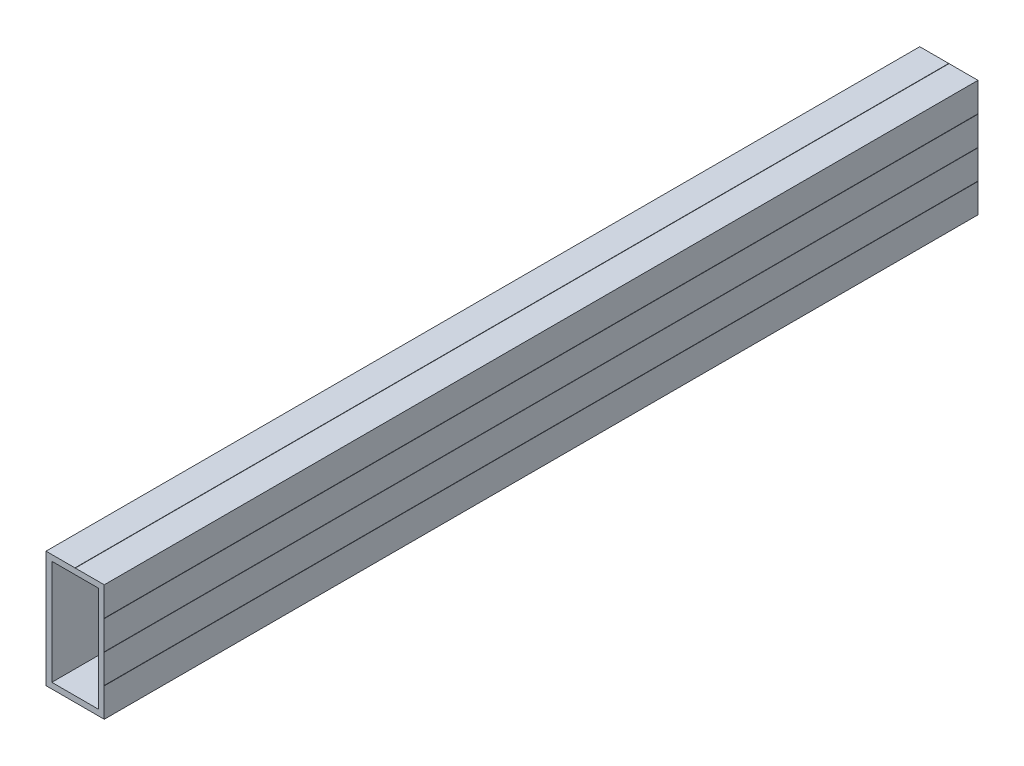
ISO-10303-21;
HEADER;
FILE_DESCRIPTION(('STEP AP214'),'2;1');
FILE_NAME('part.step','',(''),(''),'','','');
FILE_SCHEMA(('AUTOMOTIVE_DESIGN { 1 0 10303 214 1 1 1 1 }'));
ENDSEC;
DATA;
#1=APPLICATION_CONTEXT('core data for automotive mechanical design processes');
#2=APPLICATION_PROTOCOL_DEFINITION('international standard','automotive_design',2000,#1);
#3=PRODUCT_CONTEXT('',#1,'mechanical');
#4=PRODUCT('Part','Part','',(#3));
#5=PRODUCT_RELATED_PRODUCT_CATEGORY('part','',(#4));
#6=PRODUCT_DEFINITION_FORMATION('','',#4);
#7=PRODUCT_DEFINITION_CONTEXT('part definition',#1,'design');
#8=PRODUCT_DEFINITION('design','',#6,#7);
#9=PRODUCT_DEFINITION_SHAPE('','',#8);
#10=(LENGTH_UNIT() NAMED_UNIT(*) SI_UNIT(.MILLI.,.METRE.));
#11=(NAMED_UNIT(*) PLANE_ANGLE_UNIT() SI_UNIT($,.RADIAN.));
#12=(NAMED_UNIT(*) SI_UNIT($,.STERADIAN.) SOLID_ANGLE_UNIT());
#13=UNCERTAINTY_MEASURE_WITH_UNIT(LENGTH_MEASURE(1.E-05),#10,'distance_accuracy_value','');
#14=(GEOMETRIC_REPRESENTATION_CONTEXT(3) GLOBAL_UNCERTAINTY_ASSIGNED_CONTEXT((#13)) GLOBAL_UNIT_ASSIGNED_CONTEXT((#10,
#11,#12)) REPRESENTATION_CONTEXT('',''));
#15=CARTESIAN_POINT('',(0.,0.,0.));
#16=DIRECTION('',(0.,0.,1.));
#17=DIRECTION('',(1.,0.,0.));
#18=AXIS2_PLACEMENT_3D('',#15,#16,#17);
#19=CARTESIAN_POINT('',(-12.7,0.,0.));
#20=DIRECTION('',(1.,0.,0.));
#21=DIRECTION('',(0.,0.,-1.));
#22=AXIS2_PLACEMENT_3D('',#19,#20,#21);
#23=PLANE('',#22);
#24=DIRECTION('',(0.,0.,1.));
#25=VECTOR('',#24,1.);
#26=CARTESIAN_POINT('',(-12.7,25.4,-749.3));
#27=LINE('',#26,#25);
#28=CARTESIAN_POINT('',(-12.7,25.4,368.3));
#29=VERTEX_POINT('',#28);
#30=CARTESIAN_POINT('',(-12.7,25.4,749.3));
#31=VERTEX_POINT('',#30);
#32=EDGE_CURVE('E336',#29,#31,#27,.T.);
#33=ORIENTED_EDGE('',*,*,#32,.F.);
#34=DIRECTION('',(0.,-1.,0.));
#35=VECTOR('',#34,1.);
#36=CARTESIAN_POINT('',(-12.7,0.,368.3));
#37=LINE('',#36,#35);
#38=CARTESIAN_POINT('',(-12.7000000000132,12.7762,368.3));
#39=VERTEX_POINT('',#38);
#40=EDGE_CURVE('E409',#29,#39,#37,.T.);
#41=ORIENTED_EDGE('',*,*,#40,.T.);
#42=DIRECTION('',(0.,0.,1.));
#43=VECTOR('',#42,1.);
#44=CARTESIAN_POINT('',(-12.7000000000132,12.7762,-749.3));
#45=LINE('',#44,#43);
#46=CARTESIAN_POINT('',(-12.7000000000132,12.7762,749.3));
#47=VERTEX_POINT('',#46);
#48=EDGE_CURVE('E272',#39,#47,#45,.T.);
#49=ORIENTED_EDGE('',*,*,#48,.T.);
#50=DIRECTION('',(0.,-1.,0.));
#51=VECTOR('',#50,1.);
#52=CARTESIAN_POINT('',(-12.7,25.4,749.3));
#53=LINE('',#52,#51);
#54=EDGE_CURVE('E340',#31,#47,#53,.T.);
#55=ORIENTED_EDGE('',*,*,#54,.F.);
#56=EDGE_LOOP('',(#33,#41,#49,#55));
#57=FACE_BOUND('',#56,.T.);
#58=ADVANCED_FACE('F35',(#57),#23,.F.);
#59=DIRECTION('',(0.,0.,-1.));
#60=VECTOR('',#59,1.);
#61=CARTESIAN_POINT('',(-12.7,12.6238000000132,0.));
#62=LINE('',#61,#60);
#63=CARTESIAN_POINT('',(-12.7,12.6238000000132,368.3));
#64=VERTEX_POINT('',#63);
#65=CARTESIAN_POINT('',(-12.7,12.6238000000132,749.3));
#66=VERTEX_POINT('',#65);
#67=EDGE_CURVE('E274',#64,#66,#62,.F.);
#68=ORIENTED_EDGE('',*,*,#67,.F.);
#69=DIRECTION('',(0.,-1.,0.));
#70=VECTOR('',#69,1.);
#71=CARTESIAN_POINT('',(-12.7,0.,368.3));
#72=LINE('',#71,#70);
#73=CARTESIAN_POINT('',(-12.7,0.0761999999999976,368.3));
#74=VERTEX_POINT('',#73);
#75=EDGE_CURVE('E50',#64,#74,#72,.T.);
#76=ORIENTED_EDGE('',*,*,#75,.T.);
#77=DIRECTION('',(0.,0.,1.));
#78=VECTOR('',#77,1.);
#79=CARTESIAN_POINT('',(-12.7,0.0761999999999976,-749.3));
#80=LINE('',#79,#78);
#81=CARTESIAN_POINT('',(-12.7,0.0761999999999976,749.3));
#82=VERTEX_POINT('',#81);
#83=EDGE_CURVE('E280',#74,#82,#80,.T.);
#84=ORIENTED_EDGE('',*,*,#83,.T.);
#85=EDGE_CURVE('E344',#66,#82,#53,.T.);
#86=ORIENTED_EDGE('',*,*,#85,.F.);
#87=EDGE_LOOP('',(#68,#76,#84,#86));
#88=FACE_BOUND('',#87,.T.);
#89=ADVANCED_FACE('F514',(#88),#23,.F.);
#90=DIRECTION('',(0.,0.,-1.));
#91=VECTOR('',#90,1.);
#92=CARTESIAN_POINT('',(-12.7,-0.0761999999999985,0.));
#93=LINE('',#92,#91);
#94=CARTESIAN_POINT('',(-12.7,-0.0761999999999982,368.3));
#95=VERTEX_POINT('',#94);
#96=CARTESIAN_POINT('',(-12.7,-0.0761999999999985,749.3));
#97=VERTEX_POINT('',#96);
#98=EDGE_CURVE('E282',#95,#97,#93,.F.);
#99=ORIENTED_EDGE('',*,*,#98,.F.);
#100=DIRECTION('',(0.,-1.,0.));
#101=VECTOR('',#100,1.);
#102=CARTESIAN_POINT('',(-12.7,0.,368.3));
#103=LINE('',#102,#101);
#104=CARTESIAN_POINT('',(-12.7,-12.6238,368.3));
#105=VERTEX_POINT('',#104);
#106=EDGE_CURVE('E431',#95,#105,#103,.T.);
#107=ORIENTED_EDGE('',*,*,#106,.T.);
#108=DIRECTION('',(0.,0.,1.));
#109=VECTOR('',#108,1.);
#110=CARTESIAN_POINT('',(-12.7,-12.6238,-749.3));
#111=LINE('',#110,#109);
#112=CARTESIAN_POINT('',(-12.7,-12.6238,749.3));
#113=VERTEX_POINT('',#112);
#114=EDGE_CURVE('E291',#105,#113,#111,.T.);
#115=ORIENTED_EDGE('',*,*,#114,.T.);
#116=EDGE_CURVE('E597',#97,#113,#53,.T.);
#117=ORIENTED_EDGE('',*,*,#116,.F.);
#118=EDGE_LOOP('',(#99,#107,#115,#117));
#119=FACE_BOUND('',#118,.T.);
#120=ADVANCED_FACE('F506',(#119),#23,.F.);
#121=CARTESIAN_POINT('',(-12.7,-25.4,749.3));
#122=DIRECTION('',(0.,-1.,0.));
#123=DIRECTION('',(0.,0.,-1.));
#124=AXIS2_PLACEMENT_3D('',#121,#122,#123);
#125=PLANE('',#124);
#126=DIRECTION('',(-1.,0.,0.));
#127=VECTOR('',#126,1.);
#128=CARTESIAN_POINT('',(-12.7,-25.4,368.3));
#129=LINE('',#128,#127);
#130=CARTESIAN_POINT('',(-0.0762000000000089,-25.4,368.3));
#131=VERTEX_POINT('',#130);
#132=CARTESIAN_POINT('',(-12.7,-25.4,368.3));
#133=VERTEX_POINT('',#132);
#134=EDGE_CURVE('E453',#131,#133,#129,.T.);
#135=ORIENTED_EDGE('',*,*,#134,.F.);
#136=DIRECTION('',(0.,0.,1.));
#137=VECTOR('',#136,1.);
#138=CARTESIAN_POINT('',(-0.0762000000000087,-25.4,-749.3));
#139=LINE('',#138,#137);
#140=CARTESIAN_POINT('',(-0.0762000000000087,-25.4,749.3));
#141=VERTEX_POINT('',#140);
#142=EDGE_CURVE('E297',#131,#141,#139,.T.);
#143=ORIENTED_EDGE('',*,*,#142,.T.);
#144=DIRECTION('',(1.,0.,0.));
#145=VECTOR('',#144,1.);
#146=CARTESIAN_POINT('',(-12.7,-25.4,749.3));
#147=LINE('',#146,#145);
#148=CARTESIAN_POINT('',(-12.7,-25.4,749.3));
#149=VERTEX_POINT('',#148);
#150=EDGE_CURVE('E43',#149,#141,#147,.T.);
#151=ORIENTED_EDGE('',*,*,#150,.F.);
#152=DIRECTION('',(0.,0.,-1.));
#153=VECTOR('',#152,1.);
#154=CARTESIAN_POINT('',(-12.7,-25.4,749.3));
#155=LINE('',#154,#153);
#156=EDGE_CURVE('E343',#149,#133,#155,.T.);
#157=ORIENTED_EDGE('',*,*,#156,.T.);
#158=EDGE_LOOP('',(#135,#143,#151,#157));
#159=FACE_BOUND('',#158,.T.);
#160=ADVANCED_FACE('F511',(#159),#125,.T.);
#161=CARTESIAN_POINT('',(12.7,0.,0.));
#162=DIRECTION('',(1.,0.,0.));
#163=DIRECTION('',(0.,0.,-1.));
#164=AXIS2_PLACEMENT_3D('',#161,#162,#163);
#165=PLANE('',#164);
#166=DIRECTION('',(0.,-1.,0.));
#167=VECTOR('',#166,1.);
#168=CARTESIAN_POINT('',(12.7,0.,368.3));
#169=LINE('',#168,#167);
#170=CARTESIAN_POINT('',(12.7,-12.7762,368.3));
#171=VERTEX_POINT('',#170);
#172=CARTESIAN_POINT('',(12.7,-25.4,368.3));
#173=VERTEX_POINT('',#172);
#174=EDGE_CURVE('E477',#171,#173,#169,.T.);
#175=ORIENTED_EDGE('',*,*,#174,.F.);
#176=DIRECTION('',(0.,0.,1.));
#177=VECTOR('',#176,1.);
#178=CARTESIAN_POINT('',(12.7,-12.7762,-749.3));
#179=LINE('',#178,#177);
#180=CARTESIAN_POINT('',(12.7,-12.7762,749.3));
#181=VERTEX_POINT('',#180);
#182=EDGE_CURVE('E306',#171,#181,#179,.T.);
#183=ORIENTED_EDGE('',*,*,#182,.T.);
#184=DIRECTION('',(0.,-1.,0.));
#185=VECTOR('',#184,1.);
#186=CARTESIAN_POINT('',(12.7,25.4,749.3));
#187=LINE('',#186,#185);
#188=CARTESIAN_POINT('',(12.7,-25.4,749.3));
#189=VERTEX_POINT('',#188);
#190=EDGE_CURVE('E350',#181,#189,#187,.T.);
#191=ORIENTED_EDGE('',*,*,#190,.T.);
#192=DIRECTION('',(0.,0.,-1.));
#193=VECTOR('',#192,1.);
#194=CARTESIAN_POINT('',(12.7,-25.4,749.3));
#195=LINE('',#194,#193);
#196=EDGE_CURVE('E339',#189,#173,#195,.T.);
#197=ORIENTED_EDGE('',*,*,#196,.T.);
#198=EDGE_LOOP('',(#175,#183,#191,#197));
#199=FACE_BOUND('',#198,.T.);
#200=ADVANCED_FACE('F526',(#199),#165,.T.);
#201=DIRECTION('',(0.,-1.,0.));
#202=VECTOR('',#201,1.);
#203=CARTESIAN_POINT('',(12.7,0.,368.3));
#204=LINE('',#203,#202);
#205=CARTESIAN_POINT('',(12.7,-0.0762000000000003,368.3));
#206=VERTEX_POINT('',#205);
#207=CARTESIAN_POINT('',(12.7,-12.6238,368.3));
#208=VERTEX_POINT('',#207);
#209=EDGE_CURVE('E464',#206,#208,#204,.T.);
#210=ORIENTED_EDGE('',*,*,#209,.F.);
#211=DIRECTION('',(0.,0.,1.));
#212=VECTOR('',#211,1.);
#213=CARTESIAN_POINT('',(12.7,-0.0762000000000003,-749.3));
#214=LINE('',#213,#212);
#215=CARTESIAN_POINT('',(12.7,-0.0762000000000003,749.3));
#216=VERTEX_POINT('',#215);
#217=EDGE_CURVE('E314',#206,#216,#214,.T.);
#218=ORIENTED_EDGE('',*,*,#217,.T.);
#219=CARTESIAN_POINT('',(12.7,-12.6238,749.3));
#220=VERTEX_POINT('',#219);
#221=EDGE_CURVE('E558',#216,#220,#187,.T.);
#222=ORIENTED_EDGE('',*,*,#221,.T.);
#223=DIRECTION('',(0.,0.,-1.));
#224=VECTOR('',#223,1.);
#225=CARTESIAN_POINT('',(12.7,-12.6238,0.));
#226=LINE('',#225,#224);
#227=EDGE_CURVE('E308',#208,#220,#226,.F.);
#228=ORIENTED_EDGE('',*,*,#227,.F.);
#229=EDGE_LOOP('',(#210,#218,#222,#228));
#230=FACE_BOUND('',#229,.T.);
#231=ADVANCED_FACE('F535',(#230),#165,.T.);
#232=DIRECTION('',(0.,-1.,0.));
#233=VECTOR('',#232,1.);
#234=CARTESIAN_POINT('',(12.7,0.,368.3));
#235=LINE('',#234,#233);
#236=CARTESIAN_POINT('',(12.6999999999868,12.6238,368.3));
#237=VERTEX_POINT('',#236);
#238=CARTESIAN_POINT('',(12.7,0.0761999999999985,368.3));
#239=VERTEX_POINT('',#238);
#240=EDGE_CURVE('E451',#237,#239,#235,.T.);
#241=ORIENTED_EDGE('',*,*,#240,.F.);
#242=DIRECTION('',(0.,0.,1.));
#243=VECTOR('',#242,1.);
#244=CARTESIAN_POINT('',(12.6999999999868,12.6238,-749.3));
#245=LINE('',#244,#243);
#246=CARTESIAN_POINT('',(12.6999999999868,12.6238,749.3));
#247=VERTEX_POINT('',#246);
#248=EDGE_CURVE('E325',#237,#247,#245,.T.);
#249=ORIENTED_EDGE('',*,*,#248,.T.);
#250=CARTESIAN_POINT('',(12.7,0.0761999999999985,749.3));
#251=VERTEX_POINT('',#250);
#252=EDGE_CURVE('E354',#247,#251,#187,.T.);
#253=ORIENTED_EDGE('',*,*,#252,.T.);
#254=DIRECTION('',(0.,0.,-1.));
#255=VECTOR('',#254,1.);
#256=CARTESIAN_POINT('',(12.7,0.0761999999999985,0.));
#257=LINE('',#256,#255);
#258=EDGE_CURVE('E316',#239,#251,#257,.F.);
#259=ORIENTED_EDGE('',*,*,#258,.F.);
#260=EDGE_LOOP('',(#241,#249,#253,#259));
#261=FACE_BOUND('',#260,.T.);
#262=ADVANCED_FACE('F527',(#261),#165,.T.);
#263=CARTESIAN_POINT('',(-12.7,25.4,-749.3));
#264=DIRECTION('',(0.,1.,0.));
#265=DIRECTION('',(0.,0.,1.));
#266=AXIS2_PLACEMENT_3D('',#263,#264,#265);
#267=PLANE('',#266);
#268=DIRECTION('',(1.,0.,0.));
#269=VECTOR('',#268,1.);
#270=CARTESIAN_POINT('',(-12.7,25.4,368.3));
#271=LINE('',#270,#269);
#272=CARTESIAN_POINT('',(0.0761999999999968,25.4,368.3));
#273=VERTEX_POINT('',#272);
#274=CARTESIAN_POINT('',(12.7,25.4,368.3));
#275=VERTEX_POINT('',#274);
#276=EDGE_CURVE('E429',#273,#275,#271,.T.);
#277=ORIENTED_EDGE('',*,*,#276,.F.);
#278=DIRECTION('',(0.,0.,1.));
#279=VECTOR('',#278,1.);
#280=CARTESIAN_POINT('',(0.0761999999999968,25.4,-749.3));
#281=LINE('',#280,#279);
#282=CARTESIAN_POINT('',(0.0761999999999968,25.4,749.3));
#283=VERTEX_POINT('',#282);
#284=EDGE_CURVE('E330',#273,#283,#281,.T.);
#285=ORIENTED_EDGE('',*,*,#284,.T.);
#286=DIRECTION('',(1.,0.,0.));
#287=VECTOR('',#286,1.);
#288=CARTESIAN_POINT('',(-12.7,25.4,749.3));
#289=LINE('',#288,#287);
#290=CARTESIAN_POINT('',(12.7,25.4,749.3));
#291=VERTEX_POINT('',#290);
#292=EDGE_CURVE('E347',#283,#291,#289,.T.);
#293=ORIENTED_EDGE('',*,*,#292,.T.);
#294=DIRECTION('',(0.,0.,1.));
#295=VECTOR('',#294,1.);
#296=CARTESIAN_POINT('',(12.7,25.4,-749.3));
#297=LINE('',#296,#295);
#298=EDGE_CURVE('E348',#275,#291,#297,.T.);
#299=ORIENTED_EDGE('',*,*,#298,.F.);
#300=EDGE_LOOP('',(#277,#285,#293,#299));
#301=FACE_BOUND('',#300,.T.);
#302=ADVANCED_FACE('F538',(#301),#267,.T.);
#303=DIRECTION('',(1.,0.,0.));
#304=VECTOR('',#303,1.);
#305=CARTESIAN_POINT('',(-12.7,25.4,368.3));
#306=LINE('',#305,#304);
#307=CARTESIAN_POINT('',(-0.0761999999999985,25.4,368.3));
#308=VERTEX_POINT('',#307);
#309=EDGE_CURVE('E414',#29,#308,#306,.T.);
#310=ORIENTED_EDGE('',*,*,#309,.F.);
#311=ORIENTED_EDGE('',*,*,#32,.T.);
#312=CARTESIAN_POINT('',(-0.0761999999999985,25.4,749.3));
#313=VERTEX_POINT('',#312);
#314=EDGE_CURVE('E360',#31,#313,#289,.T.);
#315=ORIENTED_EDGE('',*,*,#314,.T.);
#316=DIRECTION('',(0.,0.,1.));
#317=VECTOR('',#316,1.);
#318=CARTESIAN_POINT('',(-0.0761999999999985,25.4,-749.3));
#319=LINE('',#318,#317);
#320=EDGE_CURVE('E332',#308,#313,#319,.T.);
#321=ORIENTED_EDGE('',*,*,#320,.F.);
#322=EDGE_LOOP('',(#310,#311,#315,#321));
#323=FACE_BOUND('',#322,.T.);
#324=ADVANCED_FACE('F508',(#323),#267,.T.);
#325=DIRECTION('',(-1.,0.,0.));
#326=VECTOR('',#325,1.);
#327=CARTESIAN_POINT('',(-12.7,-25.4,368.3));
#328=LINE('',#327,#326);
#329=CARTESIAN_POINT('',(0.0761999999999916,-25.4,368.3));
#330=VERTEX_POINT('',#329);
#331=EDGE_CURVE('E475',#173,#330,#328,.T.);
#332=ORIENTED_EDGE('',*,*,#331,.F.);
#333=ORIENTED_EDGE('',*,*,#196,.F.);
#334=CARTESIAN_POINT('',(0.0761999999999898,-25.4,749.3));
#335=VERTEX_POINT('',#334);
#336=EDGE_CURVE('E359',#335,#189,#147,.T.);
#337=ORIENTED_EDGE('',*,*,#336,.F.);
#338=DIRECTION('',(0.,0.,1.));
#339=VECTOR('',#338,1.);
#340=CARTESIAN_POINT('',(0.0761999999999916,-25.4,-749.3));
#341=LINE('',#340,#339);
#342=EDGE_CURVE('E301',#330,#335,#341,.T.);
#343=ORIENTED_EDGE('',*,*,#342,.F.);
#344=EDGE_LOOP('',(#332,#333,#337,#343));
#345=FACE_BOUND('',#344,.T.);
#346=ADVANCED_FACE('F496',(#345),#125,.T.);
#347=CARTESIAN_POINT('',(-12.7,25.4,749.3));
#348=DIRECTION('',(0.,0.,1.));
#349=DIRECTION('',(1.,0.,0.));
#350=AXIS2_PLACEMENT_3D('',#347,#348,#349);
#351=PLANE('',#350);
#352=DIRECTION('',(1.,0.,0.));
#353=VECTOR('',#352,1.);
#354=CARTESIAN_POINT('',(-10.16,-22.86,749.3));
#355=LINE('',#354,#353);
#356=CARTESIAN_POINT('',(-10.16,-22.86,749.3));
#357=VERTEX_POINT('',#356);
#358=CARTESIAN_POINT('',(10.16,-22.86,749.3));
#359=VERTEX_POINT('',#358);
#360=EDGE_CURVE('E479',#357,#359,#355,.T.);
#361=ORIENTED_EDGE('',*,*,#360,.F.);
#362=DIRECTION('',(0.,-1.,0.));
#363=VECTOR('',#362,1.);
#364=CARTESIAN_POINT('',(-10.16,22.86,749.3));
#365=LINE('',#364,#363);
#366=CARTESIAN_POINT('',(-10.16,22.86,749.3));
#367=VERTEX_POINT('',#366);
#368=EDGE_CURVE('E264',#367,#357,#365,.T.);
#369=ORIENTED_EDGE('',*,*,#368,.F.);
#370=DIRECTION('',(-1.,0.,0.));
#371=VECTOR('',#370,1.);
#372=CARTESIAN_POINT('',(10.16,22.86,749.3));
#373=LINE('',#372,#371);
#374=CARTESIAN_POINT('',(10.16,22.86,749.3));
#375=VERTEX_POINT('',#374);
#376=EDGE_CURVE('E483',#375,#367,#373,.T.);
#377=ORIENTED_EDGE('',*,*,#376,.F.);
#378=DIRECTION('',(0.,1.,0.));
#379=VECTOR('',#378,1.);
#380=CARTESIAN_POINT('',(10.16,-22.86,749.3));
#381=LINE('',#380,#379);
#382=EDGE_CURVE('E258',#359,#375,#381,.T.);
#383=ORIENTED_EDGE('',*,*,#382,.F.);
#384=EDGE_LOOP('',(#361,#369,#377,#383));
#385=FACE_BOUND('',#384,.T.);
#386=DIRECTION('',(-0.707106781186539,0.707106781186555,0.));
#387=VECTOR('',#386,1.);
#388=CARTESIAN_POINT('',(-12.5476000000263,12.6238000000132,749.3));
#389=LINE('',#388,#387);
#390=CARTESIAN_POINT('',(-12.6238000000066,12.6999999999934,749.3));
#391=VERTEX_POINT('',#390);
#392=EDGE_CURVE('E268',#391,#47,#389,.T.);
#393=ORIENTED_EDGE('',*,*,#392,.F.);
#394=DIRECTION('',(-0.707106781247692,-0.707106781125403,0.));
#395=VECTOR('',#394,1.);
#396=CARTESIAN_POINT('',(-6.3119000000066,19.0118999989018,749.3));
#397=LINE('',#396,#395);
#398=EDGE_CURVE('E271',#66,#391,#397,.F.);
#399=ORIENTED_EDGE('',*,*,#398,.F.);
#400=ORIENTED_EDGE('',*,*,#85,.T.);
#401=DIRECTION('',(-1.,0.,0.));
#402=VECTOR('',#401,1.);
#403=CARTESIAN_POINT('',(-12.5476,0.0761999999999985,749.3));
#404=LINE('',#403,#402);
#405=CARTESIAN_POINT('',(-12.5475999999737,0.0761999999999985,749.3));
#406=VERTEX_POINT('',#405);
#407=EDGE_CURVE('E275',#406,#82,#404,.T.);
#408=ORIENTED_EDGE('',*,*,#407,.F.);
#409=DIRECTION('',(-0.707106781247692,-0.707106781125403,0.));
#410=VECTOR('',#409,1.);
#411=CARTESIAN_POINT('',(0.0380999999999923,12.661899997797,749.3));
#412=LINE('',#411,#410);
#413=EDGE_CURVE('E278',#97,#406,#412,.F.);
#414=ORIENTED_EDGE('',*,*,#413,.F.);
#415=ORIENTED_EDGE('',*,*,#116,.T.);
#416=DIRECTION('',(-0.707106781186551,0.707106781186543,0.));
#417=VECTOR('',#416,1.);
#418=CARTESIAN_POINT('',(-12.5476,-12.7762,749.3));
#419=LINE('',#418,#417);
#420=CARTESIAN_POINT('',(-12.6238,-12.7,749.3));
#421=VERTEX_POINT('',#420);
#422=EDGE_CURVE('E283',#421,#113,#419,.T.);
#423=ORIENTED_EDGE('',*,*,#422,.F.);
#424=DIRECTION('',(-0.707106781186537,-0.707106781186558,0.));
#425=VECTOR('',#424,1.);
#426=CARTESIAN_POINT('',(6.38809999999999,6.31190000000056,749.3));
#427=LINE('',#426,#425);
#428=CARTESIAN_POINT('',(-12.7,-12.7762,749.3));
#429=VERTEX_POINT('',#428);
#430=EDGE_CURVE('E286',#429,#421,#427,.F.);
#431=ORIENTED_EDGE('',*,*,#430,.F.);
#432=EDGE_CURVE('E338',#429,#149,#53,.T.);
#433=ORIENTED_EDGE('',*,*,#432,.T.);
#434=ORIENTED_EDGE('',*,*,#150,.T.);
#435=DIRECTION('',(0.707106781186552,0.707106781186544,0.));
#436=VECTOR('',#435,1.);
#437=CARTESIAN_POINT('',(19.0118999999999,-6.31190000000029,749.3));
#438=LINE('',#437,#436);
#439=CARTESIAN_POINT('',(0.,-25.3238,749.3));
#440=VERTEX_POINT('',#439);
#441=EDGE_CURVE('E296',#440,#141,#438,.F.);
#442=ORIENTED_EDGE('',*,*,#441,.F.);
#443=DIRECTION('',(-0.707106781186547,0.707106781186548,0.));
#444=VECTOR('',#443,1.);
#445=CARTESIAN_POINT('',(0.0761999999999916,-25.4,749.3));
#446=LINE('',#445,#444);
#447=EDGE_CURVE('E293',#335,#440,#446,.T.);
#448=ORIENTED_EDGE('',*,*,#447,.F.);
#449=ORIENTED_EDGE('',*,*,#336,.T.);
#450=ORIENTED_EDGE('',*,*,#190,.F.);
#451=DIRECTION('',(0.707106781186539,-0.707106781186556,0.));
#452=VECTOR('',#451,1.);
#453=CARTESIAN_POINT('',(12.5476,-12.6238,749.3));
#454=LINE('',#453,#452);
#455=CARTESIAN_POINT('',(12.6238,-12.7,749.3));
#456=VERTEX_POINT('',#455);
#457=EDGE_CURVE('E299',#456,#181,#454,.T.);
#458=ORIENTED_EDGE('',*,*,#457,.F.);
#459=DIRECTION('',(0.707106781186553,0.707106781186542,0.));
#460=VECTOR('',#459,1.);
#461=CARTESIAN_POINT('',(19.0118999999998,-6.3119000000003,749.3));
#462=LINE('',#461,#460);
#463=EDGE_CURVE('E305',#220,#456,#462,.F.);
#464=ORIENTED_EDGE('',*,*,#463,.F.);
#465=ORIENTED_EDGE('',*,*,#221,.F.);
#466=DIRECTION('',(1.,0.,0.));
#467=VECTOR('',#466,1.);
#468=CARTESIAN_POINT('',(12.5476,-0.0761999999999985,749.3));
#469=LINE('',#468,#467);
#470=CARTESIAN_POINT('',(12.5476,-0.0761999999999985,749.3));
#471=VERTEX_POINT('',#470);
#472=EDGE_CURVE('E309',#471,#216,#469,.T.);
#473=ORIENTED_EDGE('',*,*,#472,.F.);
#474=DIRECTION('',(0.707106781186553,0.707106781186542,0.));
#475=VECTOR('',#474,1.);
#476=CARTESIAN_POINT('',(12.6618999999998,0.038099999999798,749.3));
#477=LINE('',#476,#475);
#478=EDGE_CURVE('E312',#251,#471,#477,.F.);
#479=ORIENTED_EDGE('',*,*,#478,.F.);
#480=ORIENTED_EDGE('',*,*,#252,.F.);
#481=DIRECTION('',(0.707106781186544,-0.707106781186552,0.));
#482=VECTOR('',#481,1.);
#483=CARTESIAN_POINT('',(12.5475999999736,12.7762000000132,749.3));
#484=LINE('',#483,#482);
#485=CARTESIAN_POINT('',(12.6237999999868,12.7,749.3));
#486=VERTEX_POINT('',#485);
#487=EDGE_CURVE('E317',#486,#247,#484,.T.);
#488=ORIENTED_EDGE('',*,*,#487,.F.);
#489=DIRECTION('',(0.707106781125415,0.707106781247681,0.));
#490=VECTOR('',#489,1.);
#491=CARTESIAN_POINT('',(6.31190000218278,6.38810000110456,749.3));
#492=LINE('',#491,#490);
#493=CARTESIAN_POINT('',(12.6999999999868,12.7762000000132,749.3));
#494=VERTEX_POINT('',#493);
#495=EDGE_CURVE('E320',#494,#486,#492,.F.);
#496=ORIENTED_EDGE('',*,*,#495,.F.);
#497=EDGE_CURVE('E351',#291,#494,#187,.T.);
#498=ORIENTED_EDGE('',*,*,#497,.F.);
#499=ORIENTED_EDGE('',*,*,#292,.F.);
#500=DIRECTION('',(-0.707106781186552,-0.707106781186543,0.));
#501=VECTOR('',#500,1.);
#502=CARTESIAN_POINT('',(-6.31190000000008,19.0119,749.3));
#503=LINE('',#502,#501);
#504=CARTESIAN_POINT('',(0.,25.3238,749.3));
#505=VERTEX_POINT('',#504);
#506=EDGE_CURVE('E331',#505,#283,#503,.F.);
#507=ORIENTED_EDGE('',*,*,#506,.F.);
#508=DIRECTION('',(0.707106781186548,-0.707106781186547,0.));
#509=VECTOR('',#508,1.);
#510=CARTESIAN_POINT('',(-0.0761999999999985,25.4,749.3));
#511=LINE('',#510,#509);
#512=EDGE_CURVE('E327',#313,#505,#511,.T.);
#513=ORIENTED_EDGE('',*,*,#512,.F.);
#514=ORIENTED_EDGE('',*,*,#314,.F.);
#515=ORIENTED_EDGE('',*,*,#54,.T.);
#516=EDGE_LOOP('',(#393,#399,#400,#408,#414,#415,#423,#431,#433,#434,#442,#448,#449,#450,#458,
#464,#465,#473,#479,#480,#488,#496,#498,#499,#507,#513,#514,#515));
#517=FACE_BOUND('',#516,.T.);
#518=ADVANCED_FACE('F402',(#385,#517),#351,.T.);
#519=DIRECTION('',(0.,0.,1.));
#520=VECTOR('',#519,1.);
#521=CARTESIAN_POINT('',(-12.7,-12.7762,-749.3));
#522=LINE('',#521,#520);
#523=CARTESIAN_POINT('',(-12.7,-12.7762,368.3));
#524=VERTEX_POINT('',#523);
#525=EDGE_CURVE('E288',#524,#429,#522,.T.);
#526=ORIENTED_EDGE('',*,*,#525,.F.);
#527=DIRECTION('',(0.,-1.,0.));
#528=VECTOR('',#527,1.);
#529=CARTESIAN_POINT('',(-12.7,0.,368.3));
#530=LINE('',#529,#528);
#531=EDGE_CURVE('E448',#524,#133,#530,.T.);
#532=ORIENTED_EDGE('',*,*,#531,.T.);
#533=ORIENTED_EDGE('',*,*,#156,.F.);
#534=ORIENTED_EDGE('',*,*,#432,.F.);
#535=EDGE_LOOP('',(#526,#532,#533,#534));
#536=FACE_BOUND('',#535,.T.);
#537=ADVANCED_FACE('F495',(#536),#23,.F.);
#538=DIRECTION('',(0.,-1.,0.));
#539=VECTOR('',#538,1.);
#540=CARTESIAN_POINT('',(12.7,0.,368.3));
#541=LINE('',#540,#539);
#542=CARTESIAN_POINT('',(12.7,12.7762000000132,368.3));
#543=VERTEX_POINT('',#542);
#544=EDGE_CURVE('E437',#275,#543,#541,.T.);
#545=ORIENTED_EDGE('',*,*,#544,.F.);
#546=ORIENTED_EDGE('',*,*,#298,.T.);
#547=ORIENTED_EDGE('',*,*,#497,.T.);
#548=DIRECTION('',(0.,0.,1.));
#549=VECTOR('',#548,1.);
#550=CARTESIAN_POINT('',(12.6999999999868,12.7762000000132,-749.3));
#551=LINE('',#550,#549);
#552=EDGE_CURVE('E322',#543,#494,#551,.T.);
#553=ORIENTED_EDGE('',*,*,#552,.F.);
#554=EDGE_LOOP('',(#545,#546,#547,#553));
#555=FACE_BOUND('',#554,.T.);
#556=ADVANCED_FACE('F503',(#555),#165,.T.);
#557=CARTESIAN_POINT('',(0.0761999999999968,25.4,-749.3));
#558=DIRECTION('',(-0.707106781186543,0.707106781186552,0.));
#559=DIRECTION('',(-0.707106781186552,-0.707106781186543,0.));
#560=AXIS2_PLACEMENT_3D('',#557,#558,#559);
#561=PLANE('',#560);
#562=ORIENTED_EDGE('',*,*,#284,.F.);
#563=DIRECTION('',(0.707106781186552,0.707106781186543,0.));
#564=VECTOR('',#563,1.);
#565=CARTESIAN_POINT('',(0.0761999999999968,25.4,368.3));
#566=LINE('',#565,#564);
#567=CARTESIAN_POINT('',(0.,25.3238,368.3));
#568=VERTEX_POINT('',#567);
#569=EDGE_CURVE('E426',#273,#568,#566,.F.);
#570=ORIENTED_EDGE('',*,*,#569,.T.);
#571=DIRECTION('',(0.,0.,-1.));
#572=VECTOR('',#571,1.);
#573=CARTESIAN_POINT('',(0.,25.3238,-749.3));
#574=LINE('',#573,#572);
#575=EDGE_CURVE('E334',#568,#505,#574,.F.);
#576=ORIENTED_EDGE('',*,*,#575,.T.);
#577=ORIENTED_EDGE('',*,*,#506,.T.);
#578=EDGE_LOOP('',(#562,#570,#576,#577));
#579=FACE_BOUND('',#578,.T.);
#580=ADVANCED_FACE('F524',(#579),#561,.T.);
#581=CARTESIAN_POINT('',(-0.0761999999999985,25.4,-749.3));
#582=DIRECTION('',(-0.707106781186547,-0.707106781186547,0.));
#583=DIRECTION('',(0.707106781186548,-0.707106781186548,0.));
#584=AXIS2_PLACEMENT_3D('',#581,#582,#583);
#585=PLANE('',#584);
#586=ORIENTED_EDGE('',*,*,#575,.F.);
#587=DIRECTION('',(-0.707106781186548,0.707106781186548,0.));
#588=VECTOR('',#587,1.);
#589=CARTESIAN_POINT('',(-0.0761999999999985,25.4,368.3));
#590=LINE('',#589,#588);
#591=EDGE_CURVE('E423',#568,#308,#590,.T.);
#592=ORIENTED_EDGE('',*,*,#591,.T.);
#593=ORIENTED_EDGE('',*,*,#320,.T.);
#594=ORIENTED_EDGE('',*,*,#512,.T.);
#595=EDGE_LOOP('',(#586,#592,#593,#594));
#596=FACE_BOUND('',#595,.T.);
#597=ADVANCED_FACE('F521',(#596),#585,.F.);
#598=CARTESIAN_POINT('',(12.5475999999736,12.7762000000132,-749.3));
#599=DIRECTION('',(-0.707106781186551,-0.707106781186544,0.));
#600=DIRECTION('',(0.707106781186544,-0.707106781186551,0.));
#601=AXIS2_PLACEMENT_3D('',#598,#599,#600);
#602=PLANE('',#601);
#603=ORIENTED_EDGE('',*,*,#248,.F.);
#604=DIRECTION('',(-0.707106781186544,0.707106781186551,0.));
#605=VECTOR('',#604,1.);
#606=CARTESIAN_POINT('',(12.5475999999736,12.7762000000132,368.3));
#607=LINE('',#606,#605);
#608=CARTESIAN_POINT('',(12.6237999999868,12.7,368.3));
#609=VERTEX_POINT('',#608);
#610=EDGE_CURVE('E445',#237,#609,#607,.T.);
#611=ORIENTED_EDGE('',*,*,#610,.T.);
#612=DIRECTION('',(0.,0.,-1.));
#613=VECTOR('',#612,1.);
#614=CARTESIAN_POINT('',(12.6237999999868,12.7,-749.3));
#615=LINE('',#614,#613);
#616=EDGE_CURVE('E324',#609,#486,#615,.F.);
#617=ORIENTED_EDGE('',*,*,#616,.T.);
#618=ORIENTED_EDGE('',*,*,#487,.T.);
#619=EDGE_LOOP('',(#603,#611,#617,#618));
#620=FACE_BOUND('',#619,.T.);
#621=ADVANCED_FACE('F551',(#620),#602,.F.);
#622=CARTESIAN_POINT('',(12.6999999999868,12.7762000000132,-749.3));
#623=DIRECTION('',(0.70710678124768,-0.707106781125414,0.));
#624=DIRECTION('',(0.707106781125415,0.707106781247681,0.));
#625=AXIS2_PLACEMENT_3D('',#622,#623,#624);
#626=PLANE('',#625);
#627=ORIENTED_EDGE('',*,*,#616,.F.);
#628=DIRECTION('',(-0.707106781125415,-0.707106781247681,0.));
#629=VECTOR('',#628,1.);
#630=CARTESIAN_POINT('',(12.6999999999868,12.7762000000132,368.3));
#631=LINE('',#630,#629);
#632=EDGE_CURVE('E442',#609,#543,#631,.F.);
#633=ORIENTED_EDGE('',*,*,#632,.T.);
#634=ORIENTED_EDGE('',*,*,#552,.T.);
#635=ORIENTED_EDGE('',*,*,#495,.T.);
#636=EDGE_LOOP('',(#627,#633,#634,#635));
#637=FACE_BOUND('',#636,.T.);
#638=ADVANCED_FACE('F628',(#637),#626,.T.);
#639=CARTESIAN_POINT('',(12.5476,-0.0761999999999985,-749.3));
#640=DIRECTION('',(0.,-1.,0.));
#641=DIRECTION('',(1.,0.,0.));
#642=AXIS2_PLACEMENT_3D('',#639,#640,#641);
#643=PLANE('',#642);
#644=ORIENTED_EDGE('',*,*,#217,.F.);
#645=DIRECTION('',(-1.,0.,0.));
#646=VECTOR('',#645,1.);
#647=CARTESIAN_POINT('',(12.5476,-0.0761999999999985,368.3));
#648=LINE('',#647,#646);
#649=CARTESIAN_POINT('',(12.5476,-0.0761999999999975,368.3));
#650=VERTEX_POINT('',#649);
#651=EDGE_CURVE('E461',#206,#650,#648,.T.);
#652=ORIENTED_EDGE('',*,*,#651,.T.);
#653=DIRECTION('',(0.,0.,-1.));
#654=VECTOR('',#653,1.);
#655=CARTESIAN_POINT('',(12.5476,-0.0761999999999985,0.));
#656=LINE('',#655,#654);
#657=EDGE_CURVE('E321',#650,#471,#656,.F.);
#658=ORIENTED_EDGE('',*,*,#657,.T.);
#659=ORIENTED_EDGE('',*,*,#472,.T.);
#660=EDGE_LOOP('',(#644,#652,#658,#659));
#661=FACE_BOUND('',#660,.T.);
#662=ADVANCED_FACE('F626',(#661),#643,.F.);
#663=CARTESIAN_POINT('',(12.7,0.0761999999999985,0.));
#664=DIRECTION('',(0.707106781186542,-0.707106781186553,0.));
#665=DIRECTION('',(0.707106781186553,0.707106781186542,0.));
#666=AXIS2_PLACEMENT_3D('',#663,#664,#665);
#667=PLANE('',#666);
#668=ORIENTED_EDGE('',*,*,#657,.F.);
#669=DIRECTION('',(-0.707106781186553,-0.707106781186542,0.));
#670=VECTOR('',#669,1.);
#671=CARTESIAN_POINT('',(12.7,0.0761999999999985,368.3));
#672=LINE('',#671,#670);
#673=EDGE_CURVE('E458',#650,#239,#672,.F.);
#674=ORIENTED_EDGE('',*,*,#673,.T.);
#675=ORIENTED_EDGE('',*,*,#258,.T.);
#676=ORIENTED_EDGE('',*,*,#478,.T.);
#677=EDGE_LOOP('',(#668,#674,#675,#676));
#678=FACE_BOUND('',#677,.T.);
#679=ADVANCED_FACE('F624',(#678),#667,.T.);
#680=CARTESIAN_POINT('',(12.5476,-12.6238,-749.3));
#681=DIRECTION('',(-0.707106781186555,-0.707106781186539,0.));
#682=DIRECTION('',(0.70710678118654,-0.707106781186556,0.));
#683=AXIS2_PLACEMENT_3D('',#680,#681,#682);
#684=PLANE('',#683);
#685=ORIENTED_EDGE('',*,*,#182,.F.);
#686=DIRECTION('',(-0.70710678118654,0.707106781186556,0.));
#687=VECTOR('',#686,1.);
#688=CARTESIAN_POINT('',(12.5476,-12.6238,368.3));
#689=LINE('',#688,#687);
#690=CARTESIAN_POINT('',(12.6238,-12.7,368.3));
#691=VERTEX_POINT('',#690);
#692=EDGE_CURVE('E472',#171,#691,#689,.T.);
#693=ORIENTED_EDGE('',*,*,#692,.T.);
#694=DIRECTION('',(0.,0.,-1.));
#695=VECTOR('',#694,1.);
#696=CARTESIAN_POINT('',(12.6238,-12.7,0.));
#697=LINE('',#696,#695);
#698=EDGE_CURVE('E313',#691,#456,#697,.F.);
#699=ORIENTED_EDGE('',*,*,#698,.T.);
#700=ORIENTED_EDGE('',*,*,#457,.T.);
#701=EDGE_LOOP('',(#685,#693,#699,#700));
#702=FACE_BOUND('',#701,.T.);
#703=ADVANCED_FACE('F620',(#702),#684,.F.);
#704=CARTESIAN_POINT('',(12.7,-12.6238,0.));
#705=DIRECTION('',(0.707106781186542,-0.707106781186553,0.));
#706=DIRECTION('',(0.707106781186553,0.707106781186542,0.));
#707=AXIS2_PLACEMENT_3D('',#704,#705,#706);
#708=PLANE('',#707);
#709=ORIENTED_EDGE('',*,*,#698,.F.);
#710=DIRECTION('',(-0.707106781186553,-0.707106781186542,0.));
#711=VECTOR('',#710,1.);
#712=CARTESIAN_POINT('',(12.7,-12.6238,368.3));
#713=LINE('',#712,#711);
#714=EDGE_CURVE('E469',#691,#208,#713,.F.);
#715=ORIENTED_EDGE('',*,*,#714,.T.);
#716=ORIENTED_EDGE('',*,*,#227,.T.);
#717=ORIENTED_EDGE('',*,*,#463,.T.);
#718=EDGE_LOOP('',(#709,#715,#716,#717));
#719=FACE_BOUND('',#718,.T.);
#720=ADVANCED_FACE('F623',(#719),#708,.T.);
#721=CARTESIAN_POINT('',(-0.0762000000000087,-25.4,-749.3));
#722=DIRECTION('',(0.707106781186543,-0.707106781186551,0.));
#723=DIRECTION('',(0.707106781186552,0.707106781186544,0.));
#724=AXIS2_PLACEMENT_3D('',#721,#722,#723);
#725=PLANE('',#724);
#726=ORIENTED_EDGE('',*,*,#142,.F.);
#727=DIRECTION('',(-0.707106781186552,-0.707106781186544,0.));
#728=VECTOR('',#727,1.);
#729=CARTESIAN_POINT('',(-0.0762000000000087,-25.4,368.3));
#730=LINE('',#729,#728);
#731=CARTESIAN_POINT('',(0.,-25.3238,368.3));
#732=VERTEX_POINT('',#731);
#733=EDGE_CURVE('E455',#131,#732,#730,.F.);
#734=ORIENTED_EDGE('',*,*,#733,.T.);
#735=DIRECTION('',(0.,0.,-1.));
#736=VECTOR('',#735,1.);
#737=CARTESIAN_POINT('',(0.,-25.3238,-749.3));
#738=LINE('',#737,#736);
#739=EDGE_CURVE('E300',#732,#440,#738,.F.);
#740=ORIENTED_EDGE('',*,*,#739,.T.);
#741=ORIENTED_EDGE('',*,*,#441,.T.);
#742=EDGE_LOOP('',(#726,#734,#740,#741));
#743=FACE_BOUND('',#742,.T.);
#744=ADVANCED_FACE('F578',(#743),#725,.T.);
#745=CARTESIAN_POINT('',(0.0761999999999916,-25.4,-749.3));
#746=DIRECTION('',(0.707106781186548,0.707106781186547,0.));
#747=DIRECTION('',(-0.707106781186547,0.707106781186548,0.));
#748=AXIS2_PLACEMENT_3D('',#745,#746,#747);
#749=PLANE('',#748);
#750=ORIENTED_EDGE('',*,*,#739,.F.);
#751=DIRECTION('',(0.707106781186547,-0.707106781186548,0.));
#752=VECTOR('',#751,1.);
#753=CARTESIAN_POINT('',(0.0761999999999916,-25.4,368.3));
#754=LINE('',#753,#752);
#755=EDGE_CURVE('E466',#732,#330,#754,.T.);
#756=ORIENTED_EDGE('',*,*,#755,.T.);
#757=ORIENTED_EDGE('',*,*,#342,.T.);
#758=ORIENTED_EDGE('',*,*,#447,.T.);
#759=EDGE_LOOP('',(#750,#756,#757,#758));
#760=FACE_BOUND('',#759,.T.);
#761=ADVANCED_FACE('F573',(#760),#749,.F.);
#762=CARTESIAN_POINT('',(-12.5476,-12.7762,-749.3));
#763=DIRECTION('',(0.707106781186543,0.707106781186551,0.));
#764=DIRECTION('',(-0.707106781186552,0.707106781186544,0.));
#765=AXIS2_PLACEMENT_3D('',#762,#763,#764);
#766=PLANE('',#765);
#767=ORIENTED_EDGE('',*,*,#114,.F.);
#768=DIRECTION('',(0.707106781186552,-0.707106781186544,0.));
#769=VECTOR('',#768,1.);
#770=CARTESIAN_POINT('',(-12.5476,-12.7762,368.3));
#771=LINE('',#770,#769);
#772=CARTESIAN_POINT('',(-12.6238,-12.7,368.3));
#773=VERTEX_POINT('',#772);
#774=EDGE_CURVE('E434',#105,#773,#771,.T.);
#775=ORIENTED_EDGE('',*,*,#774,.T.);
#776=DIRECTION('',(0.,0.,-1.));
#777=VECTOR('',#776,1.);
#778=CARTESIAN_POINT('',(-12.6238,-12.7,-749.3));
#779=LINE('',#778,#777);
#780=EDGE_CURVE('E290',#773,#421,#779,.F.);
#781=ORIENTED_EDGE('',*,*,#780,.T.);
#782=ORIENTED_EDGE('',*,*,#422,.T.);
#783=EDGE_LOOP('',(#767,#775,#781,#782));
#784=FACE_BOUND('',#783,.T.);
#785=ADVANCED_FACE('F592',(#784),#766,.F.);
#786=CARTESIAN_POINT('',(-12.7,-12.7762,-749.3));
#787=DIRECTION('',(-0.707106781186558,0.707106781186537,0.));
#788=DIRECTION('',(-0.707106781186537,-0.707106781186558,0.));
#789=AXIS2_PLACEMENT_3D('',#786,#787,#788);
#790=PLANE('',#789);
#791=ORIENTED_EDGE('',*,*,#780,.F.);
#792=DIRECTION('',(0.707106781186537,0.707106781186558,0.));
#793=VECTOR('',#792,1.);
#794=CARTESIAN_POINT('',(-12.7,-12.7762,368.3));
#795=LINE('',#794,#793);
#796=EDGE_CURVE('E439',#773,#524,#795,.F.);
#797=ORIENTED_EDGE('',*,*,#796,.T.);
#798=ORIENTED_EDGE('',*,*,#525,.T.);
#799=ORIENTED_EDGE('',*,*,#430,.T.);
#800=EDGE_LOOP('',(#791,#797,#798,#799));
#801=FACE_BOUND('',#800,.T.);
#802=ADVANCED_FACE('F587',(#801),#790,.T.);
#803=CARTESIAN_POINT('',(-12.5476,0.0761999999999985,-749.3));
#804=DIRECTION('',(0.,1.,0.));
#805=DIRECTION('',(-1.,0.,0.));
#806=AXIS2_PLACEMENT_3D('',#803,#804,#805);
#807=PLANE('',#806);
#808=ORIENTED_EDGE('',*,*,#83,.F.);
#809=DIRECTION('',(1.,0.,0.));
#810=VECTOR('',#809,1.);
#811=CARTESIAN_POINT('',(-12.5476,0.0761999999999985,368.3));
#812=LINE('',#811,#810);
#813=CARTESIAN_POINT('',(-12.5475999999737,0.0761999999999985,368.3));
#814=VERTEX_POINT('',#813);
#815=EDGE_CURVE('E411',#74,#814,#812,.T.);
#816=ORIENTED_EDGE('',*,*,#815,.T.);
#817=DIRECTION('',(0.,0.,-1.));
#818=VECTOR('',#817,1.);
#819=CARTESIAN_POINT('',(-12.5475999999737,0.0761999999999985,0.));
#820=LINE('',#819,#818);
#821=EDGE_CURVE('E287',#814,#406,#820,.F.);
#822=ORIENTED_EDGE('',*,*,#821,.T.);
#823=ORIENTED_EDGE('',*,*,#407,.T.);
#824=EDGE_LOOP('',(#808,#816,#822,#823));
#825=FACE_BOUND('',#824,.T.);
#826=ADVANCED_FACE('F605',(#825),#807,.F.);
#827=CARTESIAN_POINT('',(-12.7,-0.0761999999999985,0.));
#828=DIRECTION('',(-0.707106781125403,0.707106781247692,0.));
#829=DIRECTION('',(-0.707106781247692,-0.707106781125403,0.));
#830=AXIS2_PLACEMENT_3D('',#827,#828,#829);
#831=PLANE('',#830);
#832=ORIENTED_EDGE('',*,*,#821,.F.);
#833=DIRECTION('',(0.707106781247692,0.707106781125403,0.));
#834=VECTOR('',#833,1.);
#835=CARTESIAN_POINT('',(-12.7,-0.0761999999999985,368.3));
#836=LINE('',#835,#834);
#837=EDGE_CURVE('E420',#814,#95,#836,.F.);
#838=ORIENTED_EDGE('',*,*,#837,.T.);
#839=ORIENTED_EDGE('',*,*,#98,.T.);
#840=ORIENTED_EDGE('',*,*,#413,.T.);
#841=EDGE_LOOP('',(#832,#838,#839,#840));
#842=FACE_BOUND('',#841,.T.);
#843=ADVANCED_FACE('F601',(#842),#831,.T.);
#844=CARTESIAN_POINT('',(-12.5476000000263,12.6238000000132,-749.3));
#845=DIRECTION('',(0.707106781186556,0.70710678118654,0.));
#846=DIRECTION('',(-0.707106781186539,0.707106781186556,0.));
#847=AXIS2_PLACEMENT_3D('',#844,#845,#846);
#848=PLANE('',#847);
#849=ORIENTED_EDGE('',*,*,#48,.F.);
#850=DIRECTION('',(0.707106781186539,-0.707106781186556,0.));
#851=VECTOR('',#850,1.);
#852=CARTESIAN_POINT('',(-12.5476000000263,12.6238000000132,368.3));
#853=LINE('',#852,#851);
#854=CARTESIAN_POINT('',(-12.6238000000066,12.6999999999934,368.3));
#855=VERTEX_POINT('',#854);
#856=EDGE_CURVE('E395',#39,#855,#853,.T.);
#857=ORIENTED_EDGE('',*,*,#856,.T.);
#858=DIRECTION('',(0.,0.,-1.));
#859=VECTOR('',#858,1.);
#860=CARTESIAN_POINT('',(-12.6238000000066,12.6999999999934,0.));
#861=LINE('',#860,#859);
#862=EDGE_CURVE('E279',#855,#391,#861,.F.);
#863=ORIENTED_EDGE('',*,*,#862,.T.);
#864=ORIENTED_EDGE('',*,*,#392,.T.);
#865=EDGE_LOOP('',(#849,#857,#863,#864));
#866=FACE_BOUND('',#865,.T.);
#867=ADVANCED_FACE('F393',(#866),#848,.F.);
#868=CARTESIAN_POINT('',(-12.7,12.6238000000132,0.));
#869=DIRECTION('',(-0.707106781125403,0.707106781247692,0.));
#870=DIRECTION('',(-0.707106781247692,-0.707106781125403,0.));
#871=AXIS2_PLACEMENT_3D('',#868,#869,#870);
#872=PLANE('',#871);
#873=ORIENTED_EDGE('',*,*,#862,.F.);
#874=DIRECTION('',(0.707106781247692,0.707106781125403,0.));
#875=VECTOR('',#874,1.);
#876=CARTESIAN_POINT('',(-12.7,12.6238000000132,368.3));
#877=LINE('',#876,#875);
#878=EDGE_CURVE('E867',#855,#64,#877,.F.);
#879=ORIENTED_EDGE('',*,*,#878,.T.);
#880=ORIENTED_EDGE('',*,*,#67,.T.);
#881=ORIENTED_EDGE('',*,*,#398,.T.);
#882=EDGE_LOOP('',(#873,#879,#880,#881));
#883=FACE_BOUND('',#882,.T.);
#884=ADVANCED_FACE('F37',(#883),#872,.T.);
#885=CARTESIAN_POINT('',(-10.16,-22.86,-749.3));
#886=DIRECTION('',(0.,-1.,0.));
#887=DIRECTION('',(0.,0.,-1.));
#888=AXIS2_PLACEMENT_3D('',#885,#886,#887);
#889=PLANE('',#888);
#890=DIRECTION('',(0.,0.,1.));
#891=VECTOR('',#890,1.);
#892=CARTESIAN_POINT('',(10.16,-22.86,-749.3));
#893=LINE('',#892,#891);
#894=CARTESIAN_POINT('',(10.16,-22.86,368.299999999999));
#895=VERTEX_POINT('',#894);
#896=EDGE_CURVE('E260',#895,#359,#893,.T.);
#897=ORIENTED_EDGE('',*,*,#896,.F.);
#898=DIRECTION('',(-1.,0.,0.));
#899=VECTOR('',#898,1.);
#900=CARTESIAN_POINT('',(-10.16,-22.86,368.3));
#901=LINE('',#900,#899);
#902=CARTESIAN_POINT('',(-10.16,-22.86,368.3));
#903=VERTEX_POINT('',#902);
#904=EDGE_CURVE('E58',#895,#903,#901,.T.);
#905=ORIENTED_EDGE('',*,*,#904,.T.);
#906=DIRECTION('',(0.,0.,1.));
#907=VECTOR('',#906,1.);
#908=CARTESIAN_POINT('',(-10.16,-22.86,-749.3));
#909=LINE('',#908,#907);
#910=EDGE_CURVE('E262',#903,#357,#909,.T.);
#911=ORIENTED_EDGE('',*,*,#910,.T.);
#912=ORIENTED_EDGE('',*,*,#360,.T.);
#913=EDGE_LOOP('',(#897,#905,#911,#912));
#914=FACE_BOUND('',#913,.T.);
#915=ADVANCED_FACE('F488',(#914),#889,.F.);
#916=CARTESIAN_POINT('',(-10.16,22.86,-749.3));
#917=DIRECTION('',(-1.,0.,0.));
#918=DIRECTION('',(0.,0.,1.));
#919=AXIS2_PLACEMENT_3D('',#916,#917,#918);
#920=PLANE('',#919);
#921=ORIENTED_EDGE('',*,*,#910,.F.);
#922=DIRECTION('',(0.,1.,0.));
#923=VECTOR('',#922,1.);
#924=CARTESIAN_POINT('',(-10.16,22.86,368.3));
#925=LINE('',#924,#923);
#926=CARTESIAN_POINT('',(-10.16,22.86,368.3));
#927=VERTEX_POINT('',#926);
#928=EDGE_CURVE('E254',#903,#927,#925,.T.);
#929=ORIENTED_EDGE('',*,*,#928,.T.);
#930=DIRECTION('',(0.,0.,1.));
#931=VECTOR('',#930,1.);
#932=CARTESIAN_POINT('',(-10.16,22.86,-749.3));
#933=LINE('',#932,#931);
#934=EDGE_CURVE('E253',#927,#367,#933,.T.);
#935=ORIENTED_EDGE('',*,*,#934,.T.);
#936=ORIENTED_EDGE('',*,*,#368,.T.);
#937=EDGE_LOOP('',(#921,#929,#935,#936));
#938=FACE_BOUND('',#937,.T.);
#939=ADVANCED_FACE('F492',(#938),#920,.F.);
#940=CARTESIAN_POINT('',(10.16,22.86,-749.3));
#941=DIRECTION('',(0.,1.,0.));
#942=DIRECTION('',(0.,0.,1.));
#943=AXIS2_PLACEMENT_3D('',#940,#941,#942);
#944=PLANE('',#943);
#945=ORIENTED_EDGE('',*,*,#934,.F.);
#946=DIRECTION('',(1.,0.,0.));
#947=VECTOR('',#946,1.);
#948=CARTESIAN_POINT('',(10.16,22.86,368.3));
#949=LINE('',#948,#947);
#950=CARTESIAN_POINT('',(10.16,22.86,368.3));
#951=VERTEX_POINT('',#950);
#952=EDGE_CURVE('E242',#927,#951,#949,.T.);
#953=ORIENTED_EDGE('',*,*,#952,.T.);
#954=DIRECTION('',(0.,0.,1.));
#955=VECTOR('',#954,1.);
#956=CARTESIAN_POINT('',(10.16,22.86,-749.3));
#957=LINE('',#956,#955);
#958=EDGE_CURVE('E251',#951,#375,#957,.T.);
#959=ORIENTED_EDGE('',*,*,#958,.T.);
#960=ORIENTED_EDGE('',*,*,#376,.T.);
#961=EDGE_LOOP('',(#945,#953,#959,#960));
#962=FACE_BOUND('',#961,.T.);
#963=ADVANCED_FACE('F249',(#962),#944,.F.);
#964=CARTESIAN_POINT('',(10.16,-22.86,-749.3));
#965=DIRECTION('',(1.,0.,0.));
#966=DIRECTION('',(0.,0.,-1.));
#967=AXIS2_PLACEMENT_3D('',#964,#965,#966);
#968=PLANE('',#967);
#969=ORIENTED_EDGE('',*,*,#958,.F.);
#970=DIRECTION('',(0.,-1.,0.));
#971=VECTOR('',#970,1.);
#972=CARTESIAN_POINT('',(10.16,-22.86,368.3));
#973=LINE('',#972,#971);
#974=EDGE_CURVE('E11',#951,#895,#973,.T.);
#975=ORIENTED_EDGE('',*,*,#974,.T.);
#976=ORIENTED_EDGE('',*,*,#896,.T.);
#977=ORIENTED_EDGE('',*,*,#382,.T.);
#978=EDGE_LOOP('',(#969,#975,#976,#977));
#979=FACE_BOUND('',#978,.T.);
#980=ADVANCED_FACE('F256',(#979),#968,.F.);
#981=CARTESIAN_POINT('',(0.,0.,368.3));
#982=DIRECTION('',(0.,0.,1.));
#983=DIRECTION('',(1.,0.,0.));
#984=AXIS2_PLACEMENT_3D('',#981,#982,#983);
#985=PLANE('',#984);
#986=ORIENTED_EDGE('',*,*,#174,.T.);
#987=ORIENTED_EDGE('',*,*,#331,.T.);
#988=ORIENTED_EDGE('',*,*,#755,.F.);
#989=ORIENTED_EDGE('',*,*,#733,.F.);
#990=ORIENTED_EDGE('',*,*,#134,.T.);
#991=ORIENTED_EDGE('',*,*,#531,.F.);
#992=ORIENTED_EDGE('',*,*,#796,.F.);
#993=ORIENTED_EDGE('',*,*,#774,.F.);
#994=ORIENTED_EDGE('',*,*,#106,.F.);
#995=ORIENTED_EDGE('',*,*,#837,.F.);
#996=ORIENTED_EDGE('',*,*,#815,.F.);
#997=ORIENTED_EDGE('',*,*,#75,.F.);
#998=ORIENTED_EDGE('',*,*,#878,.F.);
#999=ORIENTED_EDGE('',*,*,#856,.F.);
#1000=ORIENTED_EDGE('',*,*,#40,.F.);
#1001=ORIENTED_EDGE('',*,*,#309,.T.);
#1002=ORIENTED_EDGE('',*,*,#591,.F.);
#1003=ORIENTED_EDGE('',*,*,#569,.F.);
#1004=ORIENTED_EDGE('',*,*,#276,.T.);
#1005=ORIENTED_EDGE('',*,*,#544,.T.);
#1006=ORIENTED_EDGE('',*,*,#632,.F.);
#1007=ORIENTED_EDGE('',*,*,#610,.F.);
#1008=ORIENTED_EDGE('',*,*,#240,.T.);
#1009=ORIENTED_EDGE('',*,*,#673,.F.);
#1010=ORIENTED_EDGE('',*,*,#651,.F.);
#1011=ORIENTED_EDGE('',*,*,#209,.T.);
#1012=ORIENTED_EDGE('',*,*,#714,.F.);
#1013=ORIENTED_EDGE('',*,*,#692,.F.);
#1014=EDGE_LOOP('',(#986,#987,#988,#989,#990,#991,#992,#993,#994,#995,#996,#997,#998,#999,#1000,
#1001,#1002,#1003,#1004,#1005,#1006,#1007,#1008,#1009,#1010,#1011,#1012,#1013));
#1015=FACE_BOUND('',#1014,.T.);
#1016=ORIENTED_EDGE('',*,*,#974,.F.);
#1017=ORIENTED_EDGE('',*,*,#952,.F.);
#1018=ORIENTED_EDGE('',*,*,#928,.F.);
#1019=ORIENTED_EDGE('',*,*,#904,.F.);
#1020=EDGE_LOOP('',(#1016,#1017,#1018,#1019));
#1021=FACE_BOUND('',#1020,.T.);
#1022=ADVANCED_FACE('F241',(#1015,#1021),#985,.F.);
#1023=CLOSED_SHELL('',(#58,#89,#120,#160,#200,#231,#262,#302,#324,#346,#518,#537,#556,#580,#597,
#621,#638,#662,#679,#703,#720,#744,#761,#785,#802,#826,#843,#867,#884,#915,#939,#963,#980,#1022));
#1024=MANIFOLD_SOLID_BREP('B2',#1023);
#1025=ADVANCED_BREP_SHAPE_REPRESENTATION('',(#18,#1024),#14);
#1026=SHAPE_DEFINITION_REPRESENTATION(#9,#1025);
ENDSEC;
END-ISO-10303-21;
